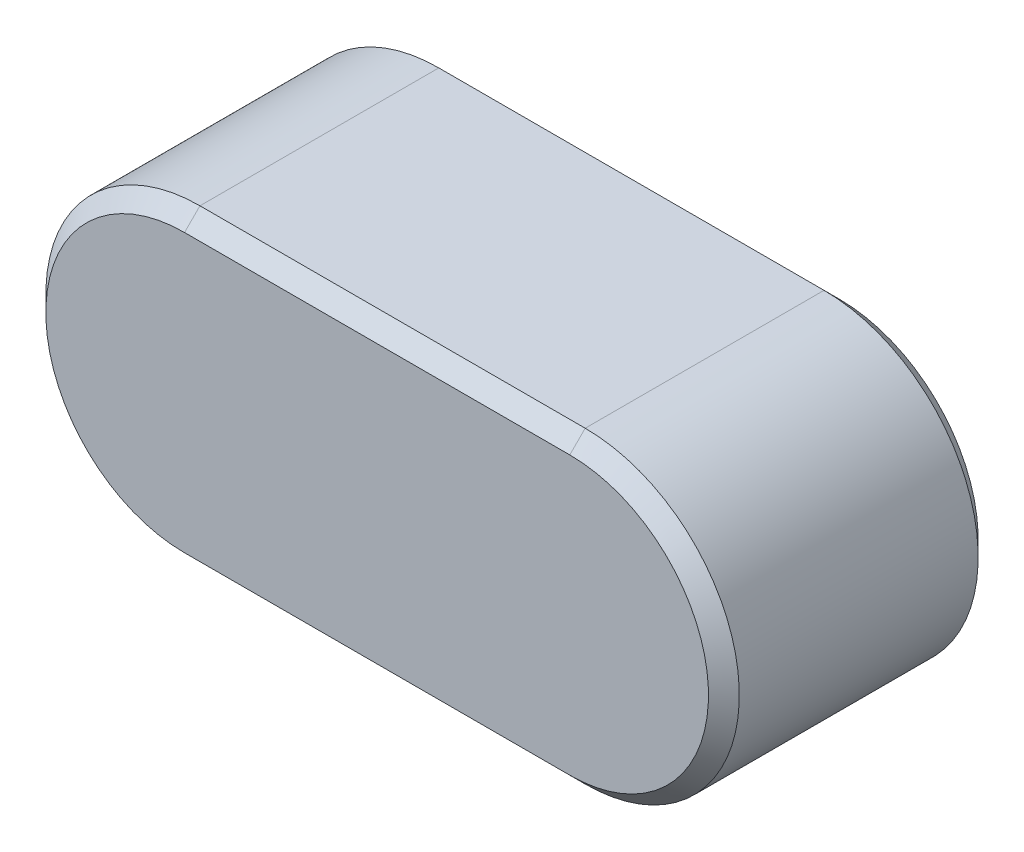
ISO-10303-21;
HEADER;
FILE_DESCRIPTION(('STEP AP214'),'2;1');
FILE_NAME('part.step','',(''),(''),'','','');
FILE_SCHEMA(('AUTOMOTIVE_DESIGN { 1 0 10303 214 1 1 1 1 }'));
ENDSEC;
DATA;
#1=APPLICATION_CONTEXT('core data for automotive mechanical design processes');
#2=APPLICATION_PROTOCOL_DEFINITION('international standard','automotive_design',2000,#1);
#3=PRODUCT_CONTEXT('',#1,'mechanical');
#4=PRODUCT('Part','Part','',(#3));
#5=PRODUCT_RELATED_PRODUCT_CATEGORY('part','',(#4));
#6=PRODUCT_DEFINITION_FORMATION('','',#4);
#7=PRODUCT_DEFINITION_CONTEXT('part definition',#1,'design');
#8=PRODUCT_DEFINITION('design','',#6,#7);
#9=PRODUCT_DEFINITION_SHAPE('','',#8);
#10=(LENGTH_UNIT() NAMED_UNIT(*) SI_UNIT(.MILLI.,.METRE.));
#11=(NAMED_UNIT(*) PLANE_ANGLE_UNIT() SI_UNIT($,.RADIAN.));
#12=(NAMED_UNIT(*) SI_UNIT($,.STERADIAN.) SOLID_ANGLE_UNIT());
#13=UNCERTAINTY_MEASURE_WITH_UNIT(LENGTH_MEASURE(1.E-05),#10,'distance_accuracy_value','');
#14=(GEOMETRIC_REPRESENTATION_CONTEXT(3) GLOBAL_UNCERTAINTY_ASSIGNED_CONTEXT((#13)) GLOBAL_UNIT_ASSIGNED_CONTEXT((#10,
#11,#12)) REPRESENTATION_CONTEXT('',''));
#15=CARTESIAN_POINT('',(0.,0.,0.));
#16=DIRECTION('',(0.,0.,1.));
#17=DIRECTION('',(1.,0.,0.));
#18=AXIS2_PLACEMENT_3D('',#15,#16,#17);
#19=CARTESIAN_POINT('',(-10.,0.,3.5));
#20=DIRECTION('',(0.,0.,-1.));
#21=DIRECTION('',(-1.,0.,0.));
#22=AXIS2_PLACEMENT_3D('',#19,#20,#21);
#23=CYLINDRICAL_SURFACE('',#22,4.);
#24=DIRECTION('',(0.,0.,-1.));
#25=VECTOR('',#24,1.);
#26=CARTESIAN_POINT('',(-10.,-4.,3.5));
#27=LINE('',#26,#25);
#28=CARTESIAN_POINT('',(-10.,-4.,3.1));
#29=VERTEX_POINT('',#28);
#30=CARTESIAN_POINT('',(-10.,-4.,-3.1));
#31=VERTEX_POINT('',#30);
#32=EDGE_CURVE('E135',#29,#31,#27,.T.);
#33=ORIENTED_EDGE('',*,*,#32,.F.);
#34=CARTESIAN_POINT('',(-10.,0.,3.1));
#35=DIRECTION('',(0.,0.,-1.));
#36=DIRECTION('',(-1.,0.,0.));
#37=AXIS2_PLACEMENT_3D('',#34,#35,#36);
#38=CIRCLE('',#37,4.);
#39=CARTESIAN_POINT('',(-10.,4.,3.1));
#40=VERTEX_POINT('',#39);
#41=EDGE_CURVE('E67',#29,#40,#38,.T.);
#42=ORIENTED_EDGE('',*,*,#41,.T.);
#43=DIRECTION('',(0.,0.,-1.));
#44=VECTOR('',#43,1.);
#45=CARTESIAN_POINT('',(-10.,4.,3.5));
#46=LINE('',#45,#44);
#47=CARTESIAN_POINT('',(-10.,4.,-3.1));
#48=VERTEX_POINT('',#47);
#49=EDGE_CURVE('E182',#40,#48,#46,.T.);
#50=ORIENTED_EDGE('',*,*,#49,.T.);
#51=CARTESIAN_POINT('',(-10.,0.,-3.1));
#52=DIRECTION('',(0.,0.,-1.));
#53=DIRECTION('',(-1.,0.,0.));
#54=AXIS2_PLACEMENT_3D('',#51,#52,#53);
#55=CIRCLE('',#54,4.);
#56=EDGE_CURVE('E122',#48,#31,#55,.F.);
#57=ORIENTED_EDGE('',*,*,#56,.T.);
#58=EDGE_LOOP('',(#33,#42,#50,#57));
#59=FACE_BOUND('',#58,.T.);
#60=ADVANCED_FACE('F43',(#59),#23,.T.);
#61=CARTESIAN_POINT('',(0.,-4.,3.5));
#62=DIRECTION('',(0.,1.,0.));
#63=DIRECTION('',(-1.,0.,0.));
#64=AXIS2_PLACEMENT_3D('',#61,#62,#63);
#65=PLANE('',#64);
#66=ORIENTED_EDGE('',*,*,#32,.T.);
#67=DIRECTION('',(1.,0.,0.));
#68=VECTOR('',#67,1.);
#69=CARTESIAN_POINT('',(0.,-4.,-3.1));
#70=LINE('',#69,#68);
#71=CARTESIAN_POINT('',(0.,-4.,-3.1));
#72=VERTEX_POINT('',#71);
#73=EDGE_CURVE('E133',#31,#72,#70,.T.);
#74=ORIENTED_EDGE('',*,*,#73,.T.);
#75=DIRECTION('',(0.,0.,-1.));
#76=VECTOR('',#75,1.);
#77=CARTESIAN_POINT('',(0.,-4.,3.5));
#78=LINE('',#77,#76);
#79=CARTESIAN_POINT('',(0.,-4.,3.1));
#80=VERTEX_POINT('',#79);
#81=EDGE_CURVE('E115',#80,#72,#78,.T.);
#82=ORIENTED_EDGE('',*,*,#81,.F.);
#83=DIRECTION('',(-1.,0.,0.));
#84=VECTOR('',#83,1.);
#85=CARTESIAN_POINT('',(0.,-4.,3.1));
#86=LINE('',#85,#84);
#87=EDGE_CURVE('E131',#80,#29,#86,.T.);
#88=ORIENTED_EDGE('',*,*,#87,.T.);
#89=EDGE_LOOP('',(#66,#74,#82,#88));
#90=FACE_BOUND('',#89,.T.);
#91=ADVANCED_FACE('F130',(#90),#65,.F.);
#92=CARTESIAN_POINT('',(0.,0.,3.5));
#93=DIRECTION('',(0.,0.,-1.));
#94=DIRECTION('',(-1.,0.,0.));
#95=AXIS2_PLACEMENT_3D('',#92,#93,#94);
#96=CYLINDRICAL_SURFACE('',#95,4.);
#97=DIRECTION('',(0.,0.,-1.));
#98=VECTOR('',#97,1.);
#99=CARTESIAN_POINT('',(0.,4.,3.5));
#100=LINE('',#99,#98);
#101=CARTESIAN_POINT('',(0.,4.,3.1));
#102=VERTEX_POINT('',#101);
#103=CARTESIAN_POINT('',(0.,4.,-3.1));
#104=VERTEX_POINT('',#103);
#105=EDGE_CURVE('E116',#102,#104,#100,.T.);
#106=ORIENTED_EDGE('',*,*,#105,.F.);
#107=CARTESIAN_POINT('',(0.,0.,3.1));
#108=DIRECTION('',(0.,0.,-1.));
#109=DIRECTION('',(-1.,0.,0.));
#110=AXIS2_PLACEMENT_3D('',#107,#108,#109);
#111=CIRCLE('',#110,4.);
#112=EDGE_CURVE('E112',#102,#80,#111,.T.);
#113=ORIENTED_EDGE('',*,*,#112,.T.);
#114=ORIENTED_EDGE('',*,*,#81,.T.);
#115=CARTESIAN_POINT('',(0.,0.,-3.1));
#116=DIRECTION('',(0.,0.,-1.));
#117=DIRECTION('',(-1.,0.,0.));
#118=AXIS2_PLACEMENT_3D('',#115,#116,#117);
#119=CIRCLE('',#118,4.);
#120=EDGE_CURVE('E123',#72,#104,#119,.F.);
#121=ORIENTED_EDGE('',*,*,#120,.T.);
#122=EDGE_LOOP('',(#106,#113,#114,#121));
#123=FACE_BOUND('',#122,.T.);
#124=ADVANCED_FACE('F114',(#123),#96,.T.);
#125=CARTESIAN_POINT('',(-10.,4.,3.5));
#126=DIRECTION('',(0.,-1.,0.));
#127=DIRECTION('',(0.,0.,-1.));
#128=AXIS2_PLACEMENT_3D('',#125,#126,#127);
#129=PLANE('',#128);
#130=ORIENTED_EDGE('',*,*,#49,.F.);
#131=DIRECTION('',(1.,0.,0.));
#132=VECTOR('',#131,1.);
#133=CARTESIAN_POINT('',(-10.,4.,3.1));
#134=LINE('',#133,#132);
#135=EDGE_CURVE('E11',#40,#102,#134,.T.);
#136=ORIENTED_EDGE('',*,*,#135,.T.);
#137=ORIENTED_EDGE('',*,*,#105,.T.);
#138=DIRECTION('',(-1.,0.,0.));
#139=VECTOR('',#138,1.);
#140=CARTESIAN_POINT('',(-10.,4.,-3.1));
#141=LINE('',#140,#139);
#142=EDGE_CURVE('E53',#104,#48,#141,.T.);
#143=ORIENTED_EDGE('',*,*,#142,.T.);
#144=EDGE_LOOP('',(#130,#136,#137,#143));
#145=FACE_BOUND('',#144,.T.);
#146=ADVANCED_FACE('F248',(#145),#129,.F.);
#147=CARTESIAN_POINT('',(-10.,0.,3.5));
#148=DIRECTION('',(0.,0.,-1.));
#149=DIRECTION('',(-1.,0.,0.));
#150=AXIS2_PLACEMENT_3D('',#147,#148,#149);
#151=PLANE('',#150);
#152=CARTESIAN_POINT('',(-10.,0.,3.5));
#153=DIRECTION('',(0.,0.,-1.));
#154=DIRECTION('',(-1.,0.,0.));
#155=AXIS2_PLACEMENT_3D('',#152,#153,#154);
#156=CIRCLE('',#155,3.6);
#157=CARTESIAN_POINT('',(-10.,3.6,3.5));
#158=VERTEX_POINT('',#157);
#159=CARTESIAN_POINT('',(-10.,-3.6,3.5));
#160=VERTEX_POINT('',#159);
#161=EDGE_CURVE('E212',#158,#160,#156,.F.);
#162=ORIENTED_EDGE('',*,*,#161,.T.);
#163=DIRECTION('',(1.,0.,0.));
#164=VECTOR('',#163,1.);
#165=CARTESIAN_POINT('',(-10.,-3.6,3.5));
#166=LINE('',#165,#164);
#167=CARTESIAN_POINT('',(0.,-3.6,3.5));
#168=VERTEX_POINT('',#167);
#169=EDGE_CURVE('E217',#160,#168,#166,.T.);
#170=ORIENTED_EDGE('',*,*,#169,.T.);
#171=CARTESIAN_POINT('',(0.,0.,3.5));
#172=DIRECTION('',(0.,0.,-1.));
#173=DIRECTION('',(-1.,0.,0.));
#174=AXIS2_PLACEMENT_3D('',#171,#172,#173);
#175=CIRCLE('',#174,3.6);
#176=CARTESIAN_POINT('',(0.,3.6,3.5));
#177=VERTEX_POINT('',#176);
#178=EDGE_CURVE('E147',#168,#177,#175,.F.);
#179=ORIENTED_EDGE('',*,*,#178,.T.);
#180=DIRECTION('',(-1.,0.,0.));
#181=VECTOR('',#180,1.);
#182=CARTESIAN_POINT('',(-10.,3.6,3.5));
#183=LINE('',#182,#181);
#184=EDGE_CURVE('E209',#177,#158,#183,.T.);
#185=ORIENTED_EDGE('',*,*,#184,.T.);
#186=EDGE_LOOP('',(#162,#170,#179,#185));
#187=FACE_BOUND('',#186,.T.);
#188=ADVANCED_FACE('F251',(#187),#151,.F.);
#189=CARTESIAN_POINT('',(-10.,0.,-3.5));
#190=DIRECTION('',(0.,0.,-1.));
#191=DIRECTION('',(-1.,0.,0.));
#192=AXIS2_PLACEMENT_3D('',#189,#190,#191);
#193=PLANE('',#192);
#194=CARTESIAN_POINT('',(0.,0.,-3.5));
#195=DIRECTION('',(0.,0.,-1.));
#196=DIRECTION('',(-1.,0.,0.));
#197=AXIS2_PLACEMENT_3D('',#194,#195,#196);
#198=CIRCLE('',#197,3.6);
#199=CARTESIAN_POINT('',(0.,3.6,-3.5));
#200=VERTEX_POINT('',#199);
#201=CARTESIAN_POINT('',(0.,-3.6,-3.5));
#202=VERTEX_POINT('',#201);
#203=EDGE_CURVE('E202',#200,#202,#198,.T.);
#204=ORIENTED_EDGE('',*,*,#203,.T.);
#205=DIRECTION('',(-1.,0.,0.));
#206=VECTOR('',#205,1.);
#207=CARTESIAN_POINT('',(-10.,-3.6,-3.5));
#208=LINE('',#207,#206);
#209=CARTESIAN_POINT('',(-10.,-3.6,-3.5));
#210=VERTEX_POINT('',#209);
#211=EDGE_CURVE('E205',#202,#210,#208,.T.);
#212=ORIENTED_EDGE('',*,*,#211,.T.);
#213=CARTESIAN_POINT('',(-10.,0.,-3.5));
#214=DIRECTION('',(0.,0.,-1.));
#215=DIRECTION('',(-1.,0.,0.));
#216=AXIS2_PLACEMENT_3D('',#213,#214,#215);
#217=CIRCLE('',#216,3.6);
#218=CARTESIAN_POINT('',(-10.,3.6,-3.5));
#219=VERTEX_POINT('',#218);
#220=EDGE_CURVE('E199',#210,#219,#217,.T.);
#221=ORIENTED_EDGE('',*,*,#220,.T.);
#222=DIRECTION('',(1.,0.,0.));
#223=VECTOR('',#222,1.);
#224=CARTESIAN_POINT('',(0.,3.6,-3.5));
#225=LINE('',#224,#223);
#226=EDGE_CURVE('E196',#219,#200,#225,.T.);
#227=ORIENTED_EDGE('',*,*,#226,.T.);
#228=EDGE_LOOP('',(#204,#212,#221,#227));
#229=FACE_BOUND('',#228,.T.);
#230=ADVANCED_FACE('F252',(#229),#193,.T.);
#231=CARTESIAN_POINT('',(-10.,4.,-3.1));
#232=DIRECTION('',(0.,0.707106781186548,-0.707106781186548));
#233=DIRECTION('',(0.,0.707106781186548,0.707106781186548));
#234=AXIS2_PLACEMENT_3D('',#231,#232,#233);
#235=PLANE('',#234);
#236=DIRECTION('',(0.,0.707106781186548,0.707106781186548));
#237=VECTOR('',#236,1.);
#238=CARTESIAN_POINT('',(0.,3.6,-3.5));
#239=LINE('',#238,#237);
#240=EDGE_CURVE('E172',#200,#104,#239,.T.);
#241=ORIENTED_EDGE('',*,*,#240,.F.);
#242=ORIENTED_EDGE('',*,*,#226,.F.);
#243=DIRECTION('',(0.,-0.707106781186548,-0.707106781186548));
#244=VECTOR('',#243,1.);
#245=CARTESIAN_POINT('',(-10.,4.,-3.1));
#246=LINE('',#245,#244);
#247=EDGE_CURVE('E155',#48,#219,#246,.T.);
#248=ORIENTED_EDGE('',*,*,#247,.F.);
#249=ORIENTED_EDGE('',*,*,#142,.F.);
#250=EDGE_LOOP('',(#241,#242,#248,#249));
#251=FACE_BOUND('',#250,.T.);
#252=ADVANCED_FACE('F255',(#251),#235,.T.);
#253=CARTESIAN_POINT('',(-10.,0.,-3.1));
#254=DIRECTION('',(0.,0.,1.));
#255=DIRECTION('',(1.,0.,0.));
#256=AXIS2_PLACEMENT_3D('',#253,#254,#255);
#257=CONICAL_SURFACE('',#256,4.,0.785398163397448);
#258=ORIENTED_EDGE('',*,*,#247,.T.);
#259=ORIENTED_EDGE('',*,*,#220,.F.);
#260=DIRECTION('',(0.,0.707106781186548,-0.707106781186548));
#261=VECTOR('',#260,1.);
#262=CARTESIAN_POINT('',(-10.,-4.,-3.1));
#263=LINE('',#262,#261);
#264=EDGE_CURVE('E165',#31,#210,#263,.T.);
#265=ORIENTED_EDGE('',*,*,#264,.F.);
#266=ORIENTED_EDGE('',*,*,#56,.F.);
#267=EDGE_LOOP('',(#258,#259,#265,#266));
#268=FACE_BOUND('',#267,.T.);
#269=ADVANCED_FACE('F227',(#268),#257,.T.);
#270=CARTESIAN_POINT('',(0.,0.,-3.1));
#271=DIRECTION('',(0.,0.,1.));
#272=DIRECTION('',(1.,0.,0.));
#273=AXIS2_PLACEMENT_3D('',#270,#271,#272);
#274=CONICAL_SURFACE('',#273,4.,0.785398163397448);
#275=ORIENTED_EDGE('',*,*,#240,.T.);
#276=ORIENTED_EDGE('',*,*,#120,.F.);
#277=DIRECTION('',(0.,-0.707106781186548,0.707106781186548));
#278=VECTOR('',#277,1.);
#279=CARTESIAN_POINT('',(0.,-3.6,-3.5));
#280=LINE('',#279,#278);
#281=EDGE_CURVE('E160',#202,#72,#280,.T.);
#282=ORIENTED_EDGE('',*,*,#281,.F.);
#283=ORIENTED_EDGE('',*,*,#203,.F.);
#284=EDGE_LOOP('',(#275,#276,#282,#283));
#285=FACE_BOUND('',#284,.T.);
#286=ADVANCED_FACE('F230',(#285),#274,.T.);
#287=CARTESIAN_POINT('',(0.,-4.,-3.1));
#288=DIRECTION('',(0.,-0.707106781186548,-0.707106781186548));
#289=DIRECTION('',(0.,0.707106781186548,-0.707106781186548));
#290=AXIS2_PLACEMENT_3D('',#287,#288,#289);
#291=PLANE('',#290);
#292=ORIENTED_EDGE('',*,*,#264,.T.);
#293=ORIENTED_EDGE('',*,*,#211,.F.);
#294=ORIENTED_EDGE('',*,*,#281,.T.);
#295=ORIENTED_EDGE('',*,*,#73,.F.);
#296=EDGE_LOOP('',(#292,#293,#294,#295));
#297=FACE_BOUND('',#296,.T.);
#298=ADVANCED_FACE('F228',(#297),#291,.T.);
#299=CARTESIAN_POINT('',(-10.,3.6,3.5));
#300=DIRECTION('',(0.,-0.707106781186551,-0.707106781186545));
#301=DIRECTION('',(0.,0.707106781186545,-0.707106781186551));
#302=AXIS2_PLACEMENT_3D('',#299,#300,#301);
#303=PLANE('',#302);
#304=DIRECTION('',(0.,-0.707106781186545,0.707106781186551));
#305=VECTOR('',#304,1.);
#306=CARTESIAN_POINT('',(0.,4.,3.1));
#307=LINE('',#306,#305);
#308=EDGE_CURVE('E152',#102,#177,#307,.T.);
#309=ORIENTED_EDGE('',*,*,#308,.F.);
#310=ORIENTED_EDGE('',*,*,#135,.F.);
#311=DIRECTION('',(0.,0.707106781186545,-0.707106781186551));
#312=VECTOR('',#311,1.);
#313=CARTESIAN_POINT('',(-10.,3.6,3.5));
#314=LINE('',#313,#312);
#315=EDGE_CURVE('E47',#158,#40,#314,.T.);
#316=ORIENTED_EDGE('',*,*,#315,.F.);
#317=ORIENTED_EDGE('',*,*,#184,.F.);
#318=EDGE_LOOP('',(#309,#310,#316,#317));
#319=FACE_BOUND('',#318,.T.);
#320=ADVANCED_FACE('F45',(#319),#303,.F.);
#321=CARTESIAN_POINT('',(-10.,0.,3.5));
#322=DIRECTION('',(0.,0.,-1.));
#323=DIRECTION('',(-1.,0.,0.));
#324=AXIS2_PLACEMENT_3D('',#321,#322,#323);
#325=CONICAL_SURFACE('',#324,3.6,0.785398163397444);
#326=ORIENTED_EDGE('',*,*,#315,.T.);
#327=ORIENTED_EDGE('',*,*,#41,.F.);
#328=DIRECTION('',(0.,-0.707106781186545,-0.707106781186551));
#329=VECTOR('',#328,1.);
#330=CARTESIAN_POINT('',(-10.,-3.6,3.5));
#331=LINE('',#330,#329);
#332=EDGE_CURVE('E143',#160,#29,#331,.T.);
#333=ORIENTED_EDGE('',*,*,#332,.F.);
#334=ORIENTED_EDGE('',*,*,#161,.F.);
#335=EDGE_LOOP('',(#326,#327,#333,#334));
#336=FACE_BOUND('',#335,.T.);
#337=ADVANCED_FACE('F236',(#336),#325,.T.);
#338=CARTESIAN_POINT('',(0.,0.,3.5));
#339=DIRECTION('',(0.,0.,-1.));
#340=DIRECTION('',(-1.,0.,0.));
#341=AXIS2_PLACEMENT_3D('',#338,#339,#340);
#342=CONICAL_SURFACE('',#341,3.6,0.785398163397444);
#343=ORIENTED_EDGE('',*,*,#308,.T.);
#344=ORIENTED_EDGE('',*,*,#178,.F.);
#345=DIRECTION('',(0.,0.707106781186545,0.707106781186551));
#346=VECTOR('',#345,1.);
#347=CARTESIAN_POINT('',(0.,-4.,3.1));
#348=LINE('',#347,#346);
#349=EDGE_CURVE('E140',#80,#168,#348,.T.);
#350=ORIENTED_EDGE('',*,*,#349,.F.);
#351=ORIENTED_EDGE('',*,*,#112,.F.);
#352=EDGE_LOOP('',(#343,#344,#350,#351));
#353=FACE_BOUND('',#352,.T.);
#354=ADVANCED_FACE('F146',(#353),#342,.T.);
#355=CARTESIAN_POINT('',(-10.,-3.6,3.5));
#356=DIRECTION('',(0.,0.707106781186551,-0.707106781186545));
#357=DIRECTION('',(0.,0.707106781186545,0.707106781186551));
#358=AXIS2_PLACEMENT_3D('',#355,#356,#357);
#359=PLANE('',#358);
#360=ORIENTED_EDGE('',*,*,#332,.T.);
#361=ORIENTED_EDGE('',*,*,#87,.F.);
#362=ORIENTED_EDGE('',*,*,#349,.T.);
#363=ORIENTED_EDGE('',*,*,#169,.F.);
#364=EDGE_LOOP('',(#360,#361,#362,#363));
#365=FACE_BOUND('',#364,.T.);
#366=ADVANCED_FACE('F138',(#365),#359,.F.);
#367=CLOSED_SHELL('',(#60,#91,#124,#146,#188,#230,#252,#269,#286,#298,#320,#337,#354,#366));
#368=MANIFOLD_SOLID_BREP('B2',#367);
#369=ADVANCED_BREP_SHAPE_REPRESENTATION('',(#18,#368),#14);
#370=SHAPE_DEFINITION_REPRESENTATION(#9,#369);
ENDSEC;
END-ISO-10303-21;
